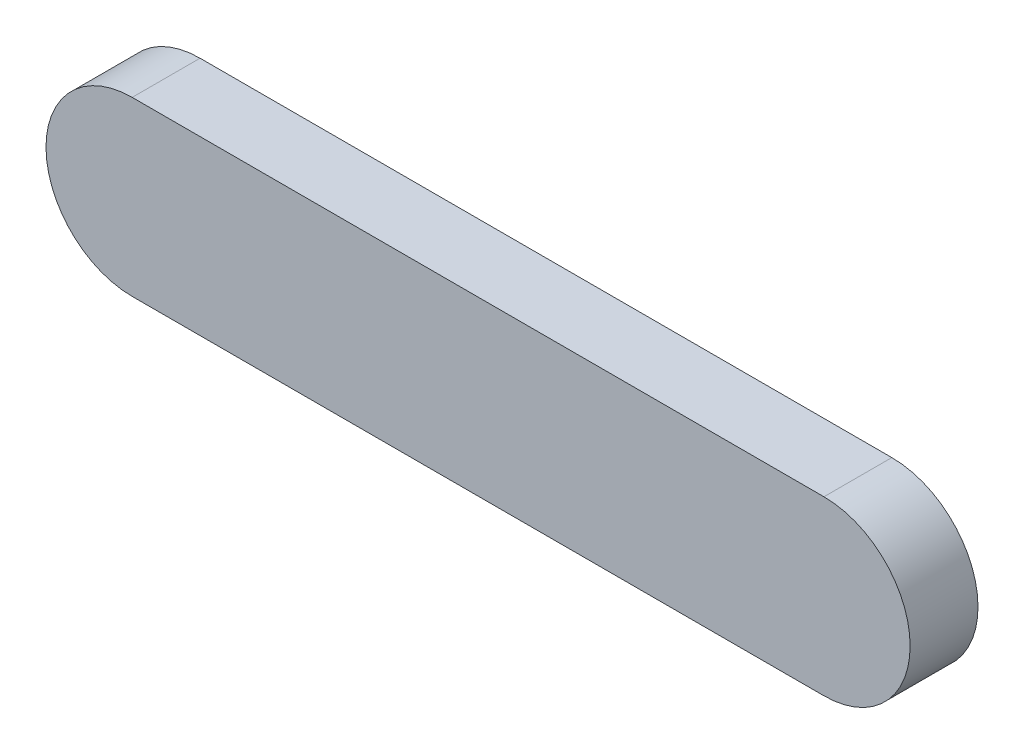
ISO-10303-21;
HEADER;
FILE_DESCRIPTION(('STEP AP214'),'2;1');
FILE_NAME('part.step','',(''),(''),'','','');
FILE_SCHEMA(('AUTOMOTIVE_DESIGN { 1 0 10303 214 1 1 1 1 }'));
ENDSEC;
DATA;
#1=APPLICATION_CONTEXT('core data for automotive mechanical design processes');
#2=APPLICATION_PROTOCOL_DEFINITION('international standard','automotive_design',2000,#1);
#3=PRODUCT_CONTEXT('',#1,'mechanical');
#4=PRODUCT('Part','Part','',(#3));
#5=PRODUCT_RELATED_PRODUCT_CATEGORY('part','',(#4));
#6=PRODUCT_DEFINITION_FORMATION('','',#4);
#7=PRODUCT_DEFINITION_CONTEXT('part definition',#1,'design');
#8=PRODUCT_DEFINITION('design','',#6,#7);
#9=PRODUCT_DEFINITION_SHAPE('','',#8);
#10=(LENGTH_UNIT() NAMED_UNIT(*) SI_UNIT(.MILLI.,.METRE.));
#11=(NAMED_UNIT(*) PLANE_ANGLE_UNIT() SI_UNIT($,.RADIAN.));
#12=(NAMED_UNIT(*) SI_UNIT($,.STERADIAN.) SOLID_ANGLE_UNIT());
#13=UNCERTAINTY_MEASURE_WITH_UNIT(LENGTH_MEASURE(1.E-05),#10,'distance_accuracy_value','');
#14=(GEOMETRIC_REPRESENTATION_CONTEXT(3) GLOBAL_UNCERTAINTY_ASSIGNED_CONTEXT((#13)) GLOBAL_UNIT_ASSIGNED_CONTEXT((#10,
#11,#12)) REPRESENTATION_CONTEXT('',''));
#15=CARTESIAN_POINT('',(0.,0.,0.));
#16=DIRECTION('',(0.,0.,1.));
#17=DIRECTION('',(1.,0.,0.));
#18=AXIS2_PLACEMENT_3D('',#15,#16,#17);
#19=CARTESIAN_POINT('',(148.59,107.5182,0.));
#20=DIRECTION('',(0.,1.,0.));
#21=DIRECTION('',(1.,0.,0.));
#22=AXIS2_PLACEMENT_3D('',#19,#20,#21);
#23=PLANE('',#22);
#24=DIRECTION('',(1.,0.,0.));
#25=VECTOR('',#24,1.);
#26=CARTESIAN_POINT('',(148.59,107.5182,0.1999996));
#27=LINE('',#26,#25);
#28=CARTESIAN_POINT('',(148.59,107.5182,0.1999996));
#29=VERTEX_POINT('',#28);
#30=CARTESIAN_POINT('',(150.628604,107.5182,0.1999996));
#31=VERTEX_POINT('',#30);
#32=EDGE_CURVE('E11',#29,#31,#27,.T.);
#33=ORIENTED_EDGE('',*,*,#32,.F.);
#34=DIRECTION('',(0.,0.,1.));
#35=VECTOR('',#34,1.);
#36=CARTESIAN_POINT('',(148.59,107.5182,0.));
#37=LINE('',#36,#35);
#38=CARTESIAN_POINT('',(148.59,107.5182,0.));
#39=VERTEX_POINT('',#38);
#40=EDGE_CURVE('E24',#39,#29,#37,.T.);
#41=ORIENTED_EDGE('',*,*,#40,.F.);
#42=DIRECTION('',(1.,0.,0.));
#43=VECTOR('',#42,1.);
#44=CARTESIAN_POINT('',(148.59,107.5182,0.));
#45=LINE('',#44,#43);
#46=CARTESIAN_POINT('',(150.628604,107.5182,0.));
#47=VERTEX_POINT('',#46);
#48=EDGE_CURVE('E75',#39,#47,#45,.T.);
#49=ORIENTED_EDGE('',*,*,#48,.T.);
#50=DIRECTION('',(0.,0.,1.));
#51=VECTOR('',#50,1.);
#52=CARTESIAN_POINT('',(150.628604,107.5182,0.));
#53=LINE('',#52,#51);
#54=EDGE_CURVE('E37',#47,#31,#53,.T.);
#55=ORIENTED_EDGE('',*,*,#54,.T.);
#56=EDGE_LOOP('',(#33,#41,#49,#55));
#57=FACE_BOUND('',#56,.T.);
#58=ADVANCED_FACE('F17',(#57),#23,.F.);
#59=CARTESIAN_POINT('',(150.628604,107.7722,0.));
#60=DIRECTION('',(0.,0.,-1.));
#61=DIRECTION('',(0.,-1.,0.));
#62=AXIS2_PLACEMENT_3D('',#59,#60,#61);
#63=CYLINDRICAL_SURFACE('',#62,0.25400000000001);
#64=CARTESIAN_POINT('',(150.628604,107.7722,0.1999996));
#65=DIRECTION('',(0.,0.,1.));
#66=DIRECTION('',(0.,-1.,0.));
#67=AXIS2_PLACEMENT_3D('',#64,#65,#66);
#68=CIRCLE('',#67,0.25400000000001);
#69=CARTESIAN_POINT('',(150.628604,108.0262,0.1999996));
#70=VERTEX_POINT('',#69);
#71=EDGE_CURVE('E83',#31,#70,#68,.T.);
#72=ORIENTED_EDGE('',*,*,#71,.F.);
#73=ORIENTED_EDGE('',*,*,#54,.F.);
#74=CARTESIAN_POINT('',(150.628604,107.7722,0.));
#75=DIRECTION('',(0.,0.,1.));
#76=DIRECTION('',(0.,-1.,0.));
#77=AXIS2_PLACEMENT_3D('',#74,#75,#76);
#78=CIRCLE('',#77,0.25400000000001);
#79=CARTESIAN_POINT('',(150.628604,108.0262,0.));
#80=VERTEX_POINT('',#79);
#81=EDGE_CURVE('E81',#47,#80,#78,.T.);
#82=ORIENTED_EDGE('',*,*,#81,.T.);
#83=DIRECTION('',(0.,0.,1.));
#84=VECTOR('',#83,1.);
#85=CARTESIAN_POINT('',(150.628604,108.0262,0.));
#86=LINE('',#85,#84);
#87=EDGE_CURVE('E67',#80,#70,#86,.T.);
#88=ORIENTED_EDGE('',*,*,#87,.T.);
#89=EDGE_LOOP('',(#72,#73,#82,#88));
#90=FACE_BOUND('',#89,.T.);
#91=ADVANCED_FACE('F89',(#90),#63,.T.);
#92=CARTESIAN_POINT('',(150.628604,108.0262,0.));
#93=DIRECTION('',(0.,-1.,0.));
#94=DIRECTION('',(-1.,0.,0.));
#95=AXIS2_PLACEMENT_3D('',#92,#93,#94);
#96=PLANE('',#95);
#97=DIRECTION('',(-1.,0.,0.));
#98=VECTOR('',#97,1.);
#99=CARTESIAN_POINT('',(150.628604,108.0262,0.1999996));
#100=LINE('',#99,#98);
#101=CARTESIAN_POINT('',(148.59,108.0262,0.1999996));
#102=VERTEX_POINT('',#101);
#103=EDGE_CURVE('E71',#70,#102,#100,.T.);
#104=ORIENTED_EDGE('',*,*,#103,.F.);
#105=ORIENTED_EDGE('',*,*,#87,.F.);
#106=DIRECTION('',(-1.,0.,0.));
#107=VECTOR('',#106,1.);
#108=CARTESIAN_POINT('',(150.628604,108.0262,0.));
#109=LINE('',#108,#107);
#110=CARTESIAN_POINT('',(148.59,108.0262,0.));
#111=VERTEX_POINT('',#110);
#112=EDGE_CURVE('E63',#80,#111,#109,.T.);
#113=ORIENTED_EDGE('',*,*,#112,.T.);
#114=DIRECTION('',(0.,0.,1.));
#115=VECTOR('',#114,1.);
#116=CARTESIAN_POINT('',(148.59,108.0262,0.));
#117=LINE('',#116,#115);
#118=EDGE_CURVE('E53',#111,#102,#117,.T.);
#119=ORIENTED_EDGE('',*,*,#118,.T.);
#120=EDGE_LOOP('',(#104,#105,#113,#119));
#121=FACE_BOUND('',#120,.T.);
#122=ADVANCED_FACE('F66',(#121),#96,.F.);
#123=CARTESIAN_POINT('',(148.59,107.7722,0.));
#124=DIRECTION('',(0.,0.,-1.));
#125=DIRECTION('',(-1.11896493820486E-13,1.,0.));
#126=AXIS2_PLACEMENT_3D('',#123,#124,#125);
#127=CYLINDRICAL_SURFACE('',#126,0.25400000000001);
#128=CARTESIAN_POINT('',(148.59,107.7722,0.1999996));
#129=DIRECTION('',(0.,0.,1.));
#130=DIRECTION('',(-1.11896493820486E-13,1.,0.));
#131=AXIS2_PLACEMENT_3D('',#128,#129,#130);
#132=CIRCLE('',#131,0.25400000000001);
#133=EDGE_CURVE('E59',#102,#29,#132,.T.);
#134=ORIENTED_EDGE('',*,*,#133,.F.);
#135=ORIENTED_EDGE('',*,*,#118,.F.);
#136=CARTESIAN_POINT('',(148.59,107.7722,0.));
#137=DIRECTION('',(0.,0.,1.));
#138=DIRECTION('',(-1.11896493820486E-13,1.,0.));
#139=AXIS2_PLACEMENT_3D('',#136,#137,#138);
#140=CIRCLE('',#139,0.25400000000001);
#141=EDGE_CURVE('E57',#111,#39,#140,.T.);
#142=ORIENTED_EDGE('',*,*,#141,.T.);
#143=ORIENTED_EDGE('',*,*,#40,.T.);
#144=EDGE_LOOP('',(#134,#135,#142,#143));
#145=FACE_BOUND('',#144,.T.);
#146=ADVANCED_FACE('F55',(#145),#127,.T.);
#147=CARTESIAN_POINT('',(148.59,107.5182,0.));
#148=DIRECTION('',(0.,0.,-1.));
#149=DIRECTION('',(-1.,0.,0.));
#150=AXIS2_PLACEMENT_3D('',#147,#148,#149);
#151=PLANE('',#150);
#152=ORIENTED_EDGE('',*,*,#141,.F.);
#153=ORIENTED_EDGE('',*,*,#112,.F.);
#154=ORIENTED_EDGE('',*,*,#81,.F.);
#155=ORIENTED_EDGE('',*,*,#48,.F.);
#156=EDGE_LOOP('',(#152,#153,#154,#155));
#157=FACE_BOUND('',#156,.T.);
#158=ADVANCED_FACE('F74',(#157),#151,.T.);
#159=CARTESIAN_POINT('',(148.59,107.5182,0.1999996));
#160=DIRECTION('',(0.,0.,-1.));
#161=DIRECTION('',(-1.,0.,0.));
#162=AXIS2_PLACEMENT_3D('',#159,#160,#161);
#163=PLANE('',#162);
#164=ORIENTED_EDGE('',*,*,#32,.T.);
#165=ORIENTED_EDGE('',*,*,#71,.T.);
#166=ORIENTED_EDGE('',*,*,#103,.T.);
#167=ORIENTED_EDGE('',*,*,#133,.T.);
#168=EDGE_LOOP('',(#164,#165,#166,#167));
#169=FACE_BOUND('',#168,.T.);
#170=ADVANCED_FACE('F91',(#169),#163,.F.);
#171=CLOSED_SHELL('',(#58,#91,#122,#146,#158,#170));
#172=MANIFOLD_SOLID_BREP('B1',#171);
#173=ADVANCED_BREP_SHAPE_REPRESENTATION('',(#18,#172),#14);
#174=SHAPE_DEFINITION_REPRESENTATION(#9,#173);
ENDSEC;
END-ISO-10303-21;
